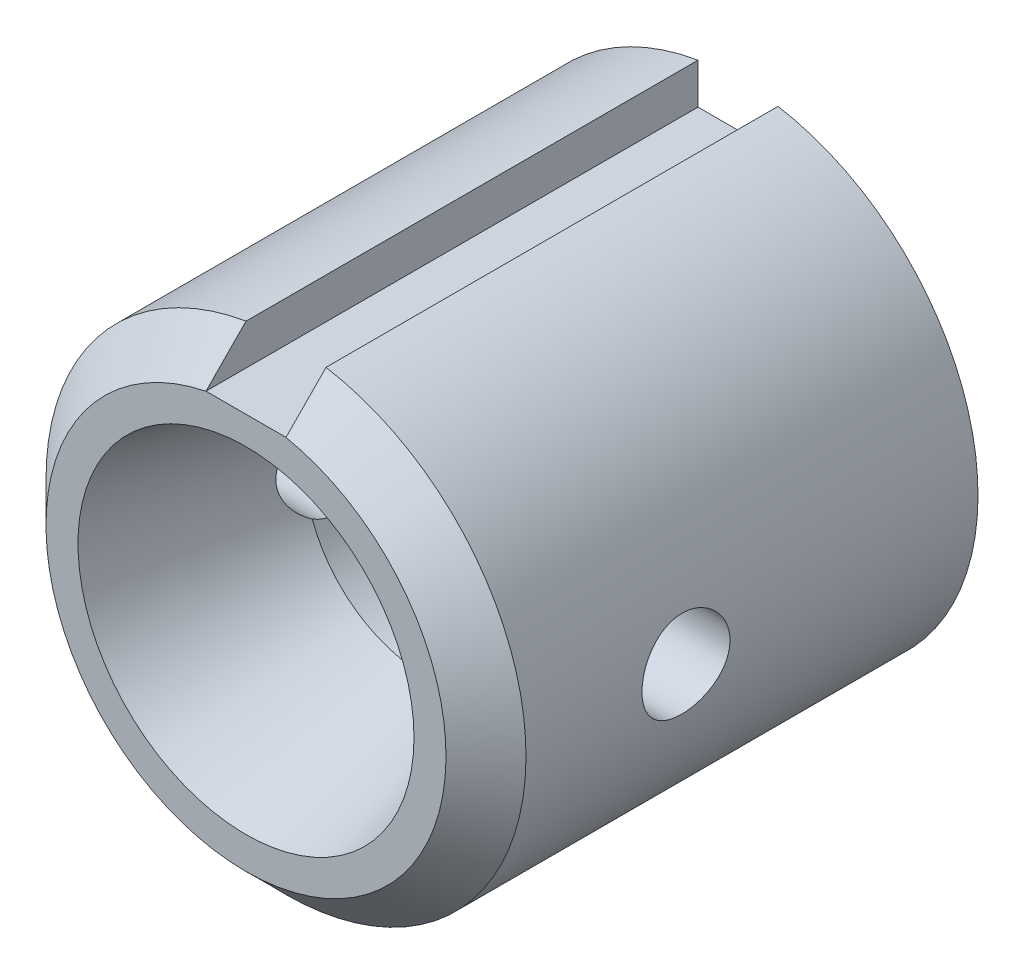
ISO-10303-21;
HEADER;
FILE_DESCRIPTION(('STEP AP214'),'2;1');
FILE_NAME('part.step','',(''),(''),'','','');
FILE_SCHEMA(('AUTOMOTIVE_DESIGN { 1 0 10303 214 1 1 1 1 }'));
ENDSEC;
DATA;
#1=APPLICATION_CONTEXT('core data for automotive mechanical design processes');
#2=APPLICATION_PROTOCOL_DEFINITION('international standard','automotive_design',2000,#1);
#3=PRODUCT_CONTEXT('',#1,'mechanical');
#4=PRODUCT('Part','Part','',(#3));
#5=PRODUCT_RELATED_PRODUCT_CATEGORY('part','',(#4));
#6=PRODUCT_DEFINITION_FORMATION('','',#4);
#7=PRODUCT_DEFINITION_CONTEXT('part definition',#1,'design');
#8=PRODUCT_DEFINITION('design','',#6,#7);
#9=PRODUCT_DEFINITION_SHAPE('','',#8);
#10=(LENGTH_UNIT() NAMED_UNIT(*) SI_UNIT(.MILLI.,.METRE.));
#11=(NAMED_UNIT(*) PLANE_ANGLE_UNIT() SI_UNIT($,.RADIAN.));
#12=(NAMED_UNIT(*) SI_UNIT($,.STERADIAN.) SOLID_ANGLE_UNIT());
#13=UNCERTAINTY_MEASURE_WITH_UNIT(LENGTH_MEASURE(1.E-05),#10,'distance_accuracy_value','');
#14=(GEOMETRIC_REPRESENTATION_CONTEXT(3) GLOBAL_UNCERTAINTY_ASSIGNED_CONTEXT((#13)) GLOBAL_UNIT_ASSIGNED_CONTEXT((#10,
#11,#12)) REPRESENTATION_CONTEXT('',''));
#15=CARTESIAN_POINT('',(0.,0.,0.));
#16=DIRECTION('',(0.,0.,1.));
#17=DIRECTION('',(1.,0.,0.));
#18=AXIS2_PLACEMENT_3D('',#15,#16,#17);
#19=CARTESIAN_POINT('',(60.,295.,6.69999999999993));
#20=DIRECTION('',(0.,0.,1.));
#21=DIRECTION('',(1.,0.,0.));
#22=AXIS2_PLACEMENT_3D('',#19,#20,#21);
#23=CYLINDRICAL_SURFACE('',#22,6.00000000000001);
#24=CARTESIAN_POINT('',(54.0002083369503,294.950000000006,15.1));
#25=CARTESIAN_POINT('',(54.0007202688159,294.888703805956,15.0999976136444));
#26=CARTESIAN_POINT('',(54.0021793161189,294.827384060505,15.0948591515165));
#27=CARTESIAN_POINT('',(54.0068772760834,294.706486979623,15.0744609248708));
#28=CARTESIAN_POINT('',(54.0101177494254,294.646911220344,15.0591922830261));
#29=CARTESIAN_POINT('',(54.0180565924925,294.531267379849,15.019021823251));
#30=CARTESIAN_POINT('',(54.0227536090026,294.475196100623,14.9941289415349));
#31=CARTESIAN_POINT('',(54.0331310874611,294.368037019153,14.9354419332142));
#32=CARTESIAN_POINT('',(54.0388114618121,294.316948773655,14.9016485993204));
#33=CARTESIAN_POINT('',(54.0506392147245,294.22058236755,14.8256843276609));
#34=CARTESIAN_POINT('',(54.0567909881065,294.175373190827,14.7834265482272));
#35=CARTESIAN_POINT('',(54.0688564566633,294.092647768584,14.69191897438));
#36=CARTESIAN_POINT('',(54.0747701354065,294.055132053289,14.6426686984475));
#37=CARTESIAN_POINT('',(54.0857594210672,293.988611386325,14.5381410912283));
#38=CARTESIAN_POINT('',(54.0908288833986,293.959667733592,14.4828240515706));
#39=CARTESIAN_POINT('',(54.099508422817,293.911514034592,14.3679970708575));
#40=CARTESIAN_POINT('',(54.103118635283,293.892303085352,14.3084875193559));
#41=CARTESIAN_POINT('',(54.1084294253396,293.864395585328,14.1877584139369));
#42=CARTESIAN_POINT('',(54.1101534368211,293.855569902812,14.126569757924));
#43=CARTESIAN_POINT('',(54.1115740440727,293.848281914292,14.0035577135561));
#44=CARTESIAN_POINT('',(54.1112708272382,293.849818650395,13.9417343843973));
#45=CARTESIAN_POINT('',(54.1086904705804,293.863111557008,13.8200925702686));
#46=CARTESIAN_POINT('',(54.1064401355067,293.874728959497,13.7602582701753));
#47=CARTESIAN_POINT('',(54.1002528172232,293.907635160738,13.6434043414942));
#48=CARTESIAN_POINT('',(54.0963157622893,293.928924370765,13.5863848327143));
#49=CARTESIAN_POINT('',(54.0871553394533,293.980706097532,13.4763695892091));
#50=CARTESIAN_POINT('',(54.0819241169554,294.011255078881,13.4234011114864));
#51=CARTESIAN_POINT('',(54.0707486996327,294.080646755264,13.3232908566409));
#52=CARTESIAN_POINT('',(54.064804430311,294.119490317219,13.2761496893824));
#53=CARTESIAN_POINT('',(54.0527254784273,294.205127669994,13.1882160745881));
#54=CARTESIAN_POINT('',(54.0465892723377,294.252042021813,13.1475411645983));
#55=CARTESIAN_POINT('',(54.0348733020739,294.352083472418,13.0746204666893));
#56=CARTESIAN_POINT('',(54.029293547541,294.405210678816,13.042374824803));
#57=CARTESIAN_POINT('',(54.0192645696668,294.516347426359,12.9871806884785));
#58=CARTESIAN_POINT('',(54.0148179160766,294.574367674995,12.9642532579587));
#59=CARTESIAN_POINT('',(54.007534630069,294.693538429022,12.9285074801542));
#60=CARTESIAN_POINT('',(54.0046978329856,294.754688613566,12.9156880989033));
#61=CARTESIAN_POINT('',(54.00094206014,294.877443987595,12.9006800981437));
#62=CARTESIAN_POINT('',(53.9999961145571,294.939030015532,12.8983413812102));
#63=CARTESIAN_POINT('',(54.0000039093303,295.061727177229,12.9039671053713));
#64=CARTESIAN_POINT('',(54.0009575463509,295.122838336641,12.9119309860064));
#65=CARTESIAN_POINT('',(54.004599015298,295.242301127035,12.9378026226283));
#66=CARTESIAN_POINT('',(54.0072716759197,295.300672151674,12.9556231971476));
#67=CARTESIAN_POINT('',(54.0140051240663,295.413604054352,13.00061696853));
#68=CARTESIAN_POINT('',(54.0180659928936,295.468164709006,13.0277907131749));
#69=CARTESIAN_POINT('',(54.0271426562016,295.572490881773,13.0910114909173));
#70=CARTESIAN_POINT('',(54.0321670206702,295.622206819054,13.1271390798256));
#71=CARTESIAN_POINT('',(54.0425625124062,295.714926043728,13.2071331108198));
#72=CARTESIAN_POINT('',(54.0479336697108,295.757928748552,13.2510002238311));
#73=CARTESIAN_POINT('',(54.0584705908645,295.836555725121,13.3458878945095));
#74=CARTESIAN_POINT('',(54.0636329081523,295.872080055531,13.3969917255396));
#75=CARTESIAN_POINT('',(54.0730659867747,295.934044772319,13.5045146965415));
#76=CARTESIAN_POINT('',(54.0773367738815,295.960485421301,13.5609336827953));
#77=CARTESIAN_POINT('',(54.0844591195687,296.003419748053,13.6772950233251));
#78=CARTESIAN_POINT('',(54.0873157073753,296.019948719061,13.7372240320187));
#79=CARTESIAN_POINT('',(54.0912836755598,296.042692175733,13.8590627524683));
#80=CARTESIAN_POINT('',(54.0923952270607,296.04890767277,13.9209722694025));
#81=CARTESIAN_POINT('',(54.0927343098606,296.050815155352,14.0440962823263));
#82=CARTESIAN_POINT('',(54.0919877530676,296.04665187492,14.1053085113926));
#83=CARTESIAN_POINT('',(54.0887550720343,296.028236035753,14.226146728523));
#84=CARTESIAN_POINT('',(54.0862689547665,296.013983517458,14.2857727229441));
#85=CARTESIAN_POINT('',(54.0798581465696,295.975853719352,14.4016720612241));
#86=CARTESIAN_POINT('',(54.075935724631,295.951991614305,14.4579505311862));
#87=CARTESIAN_POINT('',(54.0671090671621,295.895334343623,14.5657298943908));
#88=CARTESIAN_POINT('',(54.0622047717955,295.862538633522,14.6172304961853));
#89=CARTESIAN_POINT('',(54.0519089175461,295.78843282202,14.7147228074009));
#90=CARTESIAN_POINT('',(54.0465117922295,295.747016278357,14.760633035478));
#91=CARTESIAN_POINT('',(54.0359147836396,295.65706480142,14.8449011764115));
#92=CARTESIAN_POINT('',(54.0307149443272,295.60852829321,14.8832574139152));
#93=CARTESIAN_POINT('',(54.0210885690767,295.505294322675,14.9515817793949));
#94=CARTESIAN_POINT('',(54.0166678688373,295.45055502821,14.9814875419383));
#95=CARTESIAN_POINT('',(54.0091882263298,295.336768140736,15.0316338167811));
#96=CARTESIAN_POINT('',(54.0061279806199,295.277724734886,15.0518835817815));
#97=CARTESIAN_POINT('',(54.0023561822457,295.173739418562,15.0779473024479));
#98=CARTESIAN_POINT('',(54.0012293133081,295.129408645737,15.0862039547324));
#99=CARTESIAN_POINT('',(53.9999673427956,295.040056142825,15.0972311204959));
#100=CARTESIAN_POINT('',(53.9998322196565,294.995034427783,15.1000017532599));
#101=CARTESIAN_POINT('',(54.0002083369503,294.950000000006,15.1));
#102=B_SPLINE_CURVE_WITH_KNOTS('',3,(#24,#25,#26,#27,#28,#29,#30,#31,#32,#33,#34,#35,#36,#37,
#38,#39,#40,#41,#42,#43,#44,#45,#46,#47,#48,#49,#50,#51,#52,#53,#54,#55,#56,#57,#58,#59,#60,#61,
#62,#63,#64,#65,#66,#67,#68,#69,#70,#71,#72,#73,#74,#75,#76,#77,#78,#79,#80,#81,#82,#83,#84,#85,
#86,#87,#88,#89,#90,#91,#92,#93,#94,#95,#96,#97,#98,#99,#100,#101),.UNSPECIFIED.,.T.,.F.,(4,2,2,
2,2,2,2,2,2,2,2,2,2,2,2,2,2,2,2,2,2,2,2,2,2,2,2,2,2,2,2,2,2,2,2,2,2,2,4),(0.,0.183730043608427,
0.367621307436563,0.551342234646676,0.735046804446842,0.920742716117979,1.10645142143876,
1.29345773065726,1.48044668675653,1.6650851699003,1.84970658544641,2.03182615525273,
2.21395347007397,2.39721450694273,2.58049470700939,2.76679785909897,2.95310423858224,
3.13982945408964,3.3265355667398,3.51055906657045,3.69457255597529,3.87698390584466,
4.05940594071336,4.24353288366222,4.42767579609321,4.61414208533446,4.8006029834939,
4.986395932106,5.17217066019518,5.35536925570794,5.53856711691164,5.72147681261332,
5.90439765840521,6.08972747871189,6.27509835599518,6.46180354399513,6.6483294634961,
6.78331920343493,6.91830600820149),.UNSPECIFIED.);
#103=CARTESIAN_POINT('',(54.0002083369503,294.950000000006,15.1));
#104=VERTEX_POINT('',#103);
#105=EDGE_CURVE('E117',#104,#104,#102,.T.);
#106=ORIENTED_EDGE('',*,*,#105,.T.);
#107=EDGE_LOOP('',(#106));
#108=FACE_BOUND('',#107,.T.);
#109=DIRECTION('',(0.,0.,-1.));
#110=VECTOR('',#109,1.);
#111=CARTESIAN_POINT('',(61.,300.9160797831,19.));
#112=LINE('',#111,#110);
#113=CARTESIAN_POINT('',(61.,300.9160797831,17.9999999999301));
#114=VERTEX_POINT('',#113);
#115=CARTESIAN_POINT('',(61.,300.9160797831,6.69999999999993));
#116=VERTEX_POINT('',#115);
#117=EDGE_CURVE('E226',#114,#116,#112,.T.);
#118=ORIENTED_EDGE('',*,*,#117,.F.);
#119=CARTESIAN_POINT('',(60.,295.,17.9999999999301));
#120=DIRECTION('',(0.,0.,1.));
#121=DIRECTION('',(1.,0.,0.));
#122=AXIS2_PLACEMENT_3D('',#119,#120,#121);
#123=CIRCLE('',#122,6.00000000000001);
#124=CARTESIAN_POINT('',(59.,300.9160797831,17.9999999999302));
#125=VERTEX_POINT('',#124);
#126=EDGE_CURVE('E65',#114,#125,#123,.F.);
#127=ORIENTED_EDGE('',*,*,#126,.T.);
#128=DIRECTION('',(0.,0.,-1.));
#129=VECTOR('',#128,1.);
#130=CARTESIAN_POINT('',(59.,300.9160797831,19.));
#131=LINE('',#130,#129);
#132=CARTESIAN_POINT('',(59.,300.9160797831,6.69999999999993));
#133=VERTEX_POINT('',#132);
#134=EDGE_CURVE('E200',#125,#133,#131,.T.);
#135=ORIENTED_EDGE('',*,*,#134,.T.);
#136=CARTESIAN_POINT('',(60.,295.,6.69999999999993));
#137=DIRECTION('',(0.,0.,1.));
#138=DIRECTION('',(1.,0.,0.));
#139=AXIS2_PLACEMENT_3D('',#136,#137,#138);
#140=CIRCLE('',#139,6.00000000000001);
#141=EDGE_CURVE('E207',#133,#116,#140,.T.);
#142=ORIENTED_EDGE('',*,*,#141,.T.);
#143=EDGE_LOOP('',(#118,#127,#135,#142));
#144=FACE_BOUND('',#143,.T.);
#145=CARTESIAN_POINT('',(65.9997916630497,294.950000000006,15.1));
#146=CARTESIAN_POINT('',(66.0003004436368,295.011181969926,15.0999976551111));
#147=CARTESIAN_POINT('',(65.9998661558239,295.072402500563,15.0948783977039));
#148=CARTESIAN_POINT('',(65.9971955340101,295.193136244978,15.0745412098838));
#149=CARTESIAN_POINT('',(65.9949576814895,295.252647976279,15.0593147715882));
#150=CARTESIAN_POINT('',(65.9889710628795,295.368199710514,15.0192372764761));
#151=CARTESIAN_POINT('',(65.9852235690302,295.424242591033,14.994394324599));
#152=CARTESIAN_POINT('',(65.9766665214643,295.531364787736,14.9358111208835));
#153=CARTESIAN_POINT('',(65.9718570598759,295.582444533932,14.9020716407914));
#154=CARTESIAN_POINT('',(65.9616835542033,295.678748829249,14.8262665705742));
#155=CARTESIAN_POINT('',(65.9563145895184,295.723911870751,14.7841234969513));
#156=CARTESIAN_POINT('',(65.9456861010331,295.806571570897,14.6928747246476));
#157=CARTESIAN_POINT('',(65.9404265849908,295.844067687722,14.6437685342997));
#158=CARTESIAN_POINT('',(65.9305917514955,295.910618550196,14.5395062412071));
#159=CARTESIAN_POINT('',(65.9260222685577,295.939603079002,14.4843047154378));
#160=CARTESIAN_POINT('',(65.9181687217842,295.98786671045,14.3697247061979));
#161=CARTESIAN_POINT('',(65.914884564879,296.007146515833,14.3103465255233));
#162=CARTESIAN_POINT('',(65.9100270369482,296.035270089006,14.1897049258247));
#163=CARTESIAN_POINT('',(65.9084374534213,296.044212825661,14.1284652458107));
#164=CARTESIAN_POINT('',(65.907106891473,296.051714617042,14.0053356007116));
#165=CARTESIAN_POINT('',(65.9073657667413,296.050274493598,13.9434456874812));
#166=CARTESIAN_POINT('',(65.9096862071804,296.037136029832,13.8215315457416));
#167=CARTESIAN_POINT('',(65.9117267995588,296.02555703085,13.7614939968514));
#168=CARTESIAN_POINT('',(65.9173395511307,295.992657347573,13.6442267361927));
#169=CARTESIAN_POINT('',(65.9209117702657,295.971336282011,13.5869971344134));
#170=CARTESIAN_POINT('',(65.9291923347654,295.919439400518,13.4766203108571));
#171=CARTESIAN_POINT('',(65.9339065999542,295.888815144017,13.4234963277177));
#172=CARTESIAN_POINT('',(65.9439147000451,295.819213300378,13.3230950619609));
#173=CARTESIAN_POINT('',(65.9492085870549,295.780234961912,13.2758183058205));
#174=CARTESIAN_POINT('',(65.9598411653169,295.694395236378,13.1877766616267));
#175=CARTESIAN_POINT('',(65.965179479911,295.64743338079,13.147109615161));
#176=CARTESIAN_POINT('',(65.9751983441763,295.54729563423,13.0742176275001));
#177=CARTESIAN_POINT('',(65.9798788928828,295.494119734144,13.0419926986885));
#178=CARTESIAN_POINT('',(65.9880210942491,295.383017596652,12.9869155640423));
#179=CARTESIAN_POINT('',(65.9914825884158,295.325090742766,12.9640645768813));
#180=CARTESIAN_POINT('',(65.9967527679148,295.206146532462,12.9284393964189));
#181=CARTESIAN_POINT('',(65.9985616191026,295.145129486819,12.9156641919533));
#182=CARTESIAN_POINT('',(66.0002655109563,295.022644881657,12.9006926090506));
#183=CARTESIAN_POINT('',(66.0001867222168,294.961195279177,12.8983521024647));
#184=CARTESIAN_POINT('',(65.9981463580624,294.838796484248,12.9039221747406));
#185=CARTESIAN_POINT('',(65.9961848567309,294.777847272205,12.9118323502491));
#186=CARTESIAN_POINT('',(65.9905729129521,294.65855865955,12.9375675767782));
#187=CARTESIAN_POINT('',(65.9869329218651,294.60020552451,12.9553314095047));
#188=CARTESIAN_POINT('',(65.9783240806231,294.487311672641,13.0001951386847));
#189=CARTESIAN_POINT('',(65.9733551341777,294.432771232424,13.0272957116788));
#190=CARTESIAN_POINT('',(65.962523067555,294.328353471764,13.0904281238555));
#191=CARTESIAN_POINT('',(65.9566502194621,294.27853776616,13.1265601762197));
#192=CARTESIAN_POINT('',(65.9446610088691,294.185626614924,13.2065936774515));
#193=CARTESIAN_POINT('',(65.9385446242107,294.142531782554,13.2504958345418));
#194=CARTESIAN_POINT('',(65.9266354748057,294.063728668014,13.345493151653));
#195=CARTESIAN_POINT('',(65.9208477867195,294.028120794663,13.3966723300689));
#196=CARTESIAN_POINT('',(65.910318599719,293.96601232548,13.504386617707));
#197=CARTESIAN_POINT('',(65.9055770549112,293.93951133011,13.5609214918243));
#198=CARTESIAN_POINT('',(65.8977001759835,293.896546298136,13.6774079566571));
#199=CARTESIAN_POINT('',(65.8945554041957,293.88002317511,13.7373370881836));
#200=CARTESIAN_POINT('',(65.8901913464306,293.857291686741,13.859186774471));
#201=CARTESIAN_POINT('',(65.8889718351875,293.851082114653,13.9211070953867));
#202=CARTESIAN_POINT('',(65.8886028500419,293.849192998477,14.0440869702238));
#203=CARTESIAN_POINT('',(65.8894195088634,293.853341177336,14.10514384352));
#204=CARTESIAN_POINT('',(65.8929589656013,293.871673659379,14.2256726304282));
#205=CARTESIAN_POINT('',(65.8956817507091,293.885857895124,14.2851445546877));
#206=CARTESIAN_POINT('',(65.9027228691388,293.923788608455,14.4007288084808));
#207=CARTESIAN_POINT('',(65.9070382572138,293.947517442176,14.4568471187508));
#208=CARTESIAN_POINT('',(65.9167969648917,294.003843828185,14.5643321512167));
#209=CARTESIAN_POINT('',(65.9222403654545,294.036442017099,14.6156985319729));
#210=CARTESIAN_POINT('',(65.9337698935936,294.110177032285,14.7130814068712));
#211=CARTESIAN_POINT('',(65.9398646866455,294.151438550203,14.7590024760511));
#212=CARTESIAN_POINT('',(65.9519794612457,294.241065645667,14.8433259548957));
#213=CARTESIAN_POINT('',(65.9579994246144,294.28943291431,14.881726569678));
#214=CARTESIAN_POINT('',(65.9693903963353,294.392472903797,14.950279695171));
#215=CARTESIAN_POINT('',(65.9747543339126,294.447203698249,14.980346128226));
#216=CARTESIAN_POINT('',(65.9841912967498,294.561020405568,15.0308067157341));
#217=CARTESIAN_POINT('',(65.9882655400507,294.620102143811,15.0512100055543));
#218=CARTESIAN_POINT('',(65.9938325869623,294.724467598911,15.077588068482));
#219=CARTESIAN_POINT('',(65.9957260738773,294.769135254653,15.0859775213402));
#220=CARTESIAN_POINT('',(65.9985167744405,294.85919487081,15.0971842865129));
#221=CARTESIAN_POINT('',(65.9994140134236,294.904586812776,15.1000017405271));
#222=CARTESIAN_POINT('',(65.9997916630497,294.950000000006,15.1));
#223=B_SPLINE_CURVE_WITH_KNOTS('',3,(#145,#146,#147,#148,#149,#150,#151,#152,#153,#154,#155,
#156,#157,#158,#159,#160,#161,#162,#163,#164,#165,#166,#167,#168,#169,#170,#171,#172,#173,#174,
#175,#176,#177,#178,#179,#180,#181,#182,#183,#184,#185,#186,#187,#188,#189,#190,#191,#192,#193,
#194,#195,#196,#197,#198,#199,#200,#201,#202,#203,#204,#205,#206,#207,#208,#209,#210,#211,#212,
#213,#214,#215,#216,#217,#218,#219,#220,#221,#222),.UNSPECIFIED.,.T.,.F.,(4,2,2,2,2,2,2,2,2,2,2,
2,2,2,2,2,2,2,2,2,2,2,2,2,2,2,2,2,2,2,2,2,2,2,2,2,2,2,4),(0.,0.183386467259153,
0.366927499126928,0.550314175536274,0.733684948949655,0.918831903935527,1.10399193870133,
1.29063911260044,1.47727276901466,1.66210436312249,1.84692132750083,2.0295916811869,
2.21226918449923,2.3959146621236,2.57957666293736,2.76574908316017,2.95192177647397,
3.13811866578745,3.32429686676477,3.5078953711051,3.69148665125943,3.87394989708342,
4.05642636698709,4.24102521619444,4.42564089972934,4.61259355742401,4.79953801204667,
4.98536428698171,5.17116881763297,5.35390357582882,5.53663710611146,5.71903438166212,
5.9014447528106,6.08668671292491,6.27197283040299,6.45910680552273,6.64606351254706,
6.78218818756319,6.91830940079264),.UNSPECIFIED.);
#224=CARTESIAN_POINT('',(65.9997916630497,294.950000000006,15.1));
#225=VERTEX_POINT('',#224);
#226=EDGE_CURVE('E119',#225,#225,#223,.T.);
#227=ORIENTED_EDGE('',*,*,#226,.T.);
#228=EDGE_LOOP('',(#227));
#229=FACE_BOUND('',#228,.T.);
#230=ADVANCED_FACE('F36',(#108,#144,#229),#23,.T.);
#231=CARTESIAN_POINT('',(60.,295.,6.69999999999993));
#232=DIRECTION('',(0.,0.,-1.));
#233=DIRECTION('',(-1.,0.,0.));
#234=AXIS2_PLACEMENT_3D('',#231,#232,#233);
#235=CYLINDRICAL_SURFACE('',#234,3.00000000000002);
#236=CARTESIAN_POINT('',(60.,295.,6.69999999999993));
#237=DIRECTION('',(0.,0.,-1.));
#238=DIRECTION('',(-1.,0.,0.));
#239=AXIS2_PLACEMENT_3D('',#236,#237,#238);
#240=CIRCLE('',#239,3.00000000000002);
#241=CARTESIAN_POINT('',(57.,295.,6.69999999999993));
#242=VERTEX_POINT('',#241);
#243=EDGE_CURVE('E151',#242,#242,#240,.T.);
#244=ORIENTED_EDGE('',*,*,#243,.T.);
#245=EDGE_LOOP('',(#244));
#246=FACE_BOUND('',#245,.T.);
#247=CARTESIAN_POINT('',(62.9995833043943,294.950000000006,15.1));
#248=CARTESIAN_POINT('',(63.0005759745772,295.009464727088,15.10000192451));
#249=CARTESIAN_POINT('',(62.9997818578641,295.068946192172,15.0951631427205));
#250=CARTESIAN_POINT('',(62.9947907837317,295.186198561201,15.0759822242544));
#251=CARTESIAN_POINT('',(62.9905943244969,295.243969714292,15.061641478949));
#252=CARTESIAN_POINT('',(62.9793242679031,295.356090278295,15.0240037473474));
#253=CARTESIAN_POINT('',(62.9722555942246,295.410445361982,15.0007220916951));
#254=CARTESIAN_POINT('',(62.9560222574873,295.514498806819,14.9459390118202));
#255=CARTESIAN_POINT('',(62.9468570537377,295.56419596203,14.9144354668929));
#256=CARTESIAN_POINT('',(62.927050081837,295.659412548661,14.8428535093252));
#257=CARTESIAN_POINT('',(62.9163684872221,295.704730546125,14.8025183215854));
#258=CARTESIAN_POINT('',(62.894942006064,295.788142640948,14.7149647955348));
#259=CARTESIAN_POINT('',(62.8841971030355,295.826234762457,14.6677445807996));
#260=CARTESIAN_POINT('',(62.8634619669805,295.895513535211,14.5656402291538));
#261=CARTESIAN_POINT('',(62.8535146836605,295.926390547225,14.5105363215184));
#262=CARTESIAN_POINT('',(62.83611660327,295.978365557859,14.3955282243271));
#263=CARTESIAN_POINT('',(62.8286650084125,295.999466682328,14.3356255763686));
#264=CARTESIAN_POINT('',(62.8174834547286,296.030559832468,14.2148211811406));
#265=CARTESIAN_POINT('',(62.8136369624101,296.040900997866,14.1540204739281));
#266=CARTESIAN_POINT('',(62.80978080996,296.051268344086,14.0314345836093));
#267=CARTESIAN_POINT('',(62.809769764456,296.051298249359,13.9696497640309));
#268=CARTESIAN_POINT('',(62.8134799919414,296.041322764124,13.8502860311142));
#269=CARTESIAN_POINT('',(62.8170062121947,296.031841822372,13.7926560773861));
#270=CARTESIAN_POINT('',(62.8270526718911,296.003987080429,13.6798641615416));
#271=CARTESIAN_POINT('',(62.8335733141806,295.985612083681,13.6247025325907));
#272=CARTESIAN_POINT('',(62.848964618418,295.940202726327,13.5173491648724));
#273=CARTESIAN_POINT('',(62.8578719685796,295.91303166509,13.4652207487592));
#274=CARTESIAN_POINT('',(62.8769854417581,295.850887403856,13.3661023472699));
#275=CARTESIAN_POINT('',(62.8871919758366,295.815911731833,13.3191139969966));
#276=CARTESIAN_POINT('',(62.9084323545236,295.736745213022,13.228737105986));
#277=CARTESIAN_POINT('',(62.9194798007882,295.692136859443,13.185716626533));
#278=CARTESIAN_POINT('',(62.9405732282608,295.596187050188,13.1076619385868));
#279=CARTESIAN_POINT('',(62.9506191069178,295.544844906279,13.0726285474234));
#280=CARTESIAN_POINT('',(62.9686391022655,295.436166027114,13.0112775911562));
#281=CARTESIAN_POINT('',(62.9765921914972,295.378776005648,12.9850478084523));
#282=CARTESIAN_POINT('',(62.9893032580109,295.260044386056,12.9427204400065));
#283=CARTESIAN_POINT('',(62.9940625702207,295.198704450671,12.9266186211773));
#284=CARTESIAN_POINT('',(62.9995935190087,295.077151422357,12.9057230878677));
#285=CARTESIAN_POINT('',(63.0005544157142,295.01703788488,12.9003993227213));
#286=CARTESIAN_POINT('',(62.9988270088297,294.896808045944,12.8996442479994));
#287=CARTESIAN_POINT('',(62.9961393616162,294.836691746928,12.90421115917));
#288=CARTESIAN_POINT('',(62.9874731447249,294.720155174482,12.9227151060123));
#289=CARTESIAN_POINT('',(62.9816020591475,294.663678163739,12.9363492328209));
#290=CARTESIAN_POINT('',(62.9671610417967,294.553878502868,12.9721749492025));
#291=CARTESIAN_POINT('',(62.9585907106563,294.5005563209,12.9943678051918));
#292=CARTESIAN_POINT('',(62.9391836473872,294.3966015533,13.0474924197942));
#293=CARTESIAN_POINT('',(62.928280884803,294.346117891128,13.0786908436107));
#294=CARTESIAN_POINT('',(62.9053955028154,294.250949534723,13.1486369618921));
#295=CARTESIAN_POINT('',(62.8934124752392,294.206267048129,13.1873875163724));
#296=CARTESIAN_POINT('',(62.8687911415104,294.121304877973,13.2739503526239));
#297=CARTESIAN_POINT('',(62.8561544529369,294.081421802952,13.3221534846199));
#298=CARTESIAN_POINT('',(62.8322813685185,294.010254873842,13.4248633715775));
#299=CARTESIAN_POINT('',(62.8210450510259,293.978971500798,13.4793704789251));
#300=CARTESIAN_POINT('',(62.8013143788561,293.926016700872,13.5933065300771));
#301=CARTESIAN_POINT('',(62.7928180848141,293.904338471473,13.6527319551369));
#302=CARTESIAN_POINT('',(62.7796918021708,293.871446262233,13.7748088674783));
#303=CARTESIAN_POINT('',(62.7750592917513,293.860225456469,13.8374582221647));
#304=CARTESIAN_POINT('',(62.7704831516799,293.849150304259,13.9596036900433));
#305=CARTESIAN_POINT('',(62.770241568819,293.848573638527,14.0190238309842));
#306=CARTESIAN_POINT('',(62.773716538186,293.856970324012,14.1370617217064));
#307=CARTESIAN_POINT('',(62.7774327369046,293.865942822296,14.1956795426774));
#308=CARTESIAN_POINT('',(62.7881822963058,293.892644724784,14.308657347786));
#309=CARTESIAN_POINT('',(62.7951120511691,293.910101386838,14.3630924645299));
#310=CARTESIAN_POINT('',(62.8114759807293,293.9530386176,14.4682927406988));
#311=CARTESIAN_POINT('',(62.8209107940381,293.978521232664,14.519056960101));
#312=CARTESIAN_POINT('',(62.841900228313,294.038406939048,14.61850629086));
#313=CARTESIAN_POINT('',(62.8535428752572,294.073223440873,14.6669236532954));
#314=CARTESIAN_POINT('',(62.8773825942808,294.150124296692,14.7574489076428));
#315=CARTESIAN_POINT('',(62.8895798522069,294.192211100341,14.7995546639621));
#316=CARTESIAN_POINT('',(62.91405170259,294.28533447273,14.8787286241908));
#317=CARTESIAN_POINT('',(62.926290487136,294.336746278297,14.9153684975514));
#318=CARTESIAN_POINT('',(62.9488141437471,294.445409078173,14.9794727498507));
#319=CARTESIAN_POINT('',(62.9590988783284,294.502660482913,15.0069364832734));
#320=CARTESIAN_POINT('',(62.9769360796163,294.623558684906,15.0524974077331));
#321=CARTESIAN_POINT('',(62.9843800279978,294.687359388161,15.0702321779413));
#322=CARTESIAN_POINT('',(62.9951492516882,294.817433984541,15.093979393779));
#323=CARTESIAN_POINT('',(62.9984766400927,294.883706590785,15.0999978544873));
#324=CARTESIAN_POINT('',(62.9995833043943,294.950000000006,15.1));
#325=B_SPLINE_CURVE_WITH_KNOTS('',3,(#247,#248,#249,#250,#251,#252,#253,#254,#255,#256,#257,
#258,#259,#260,#261,#262,#263,#264,#265,#266,#267,#268,#269,#270,#271,#272,#273,#274,#275,#276,
#277,#278,#279,#280,#281,#282,#283,#284,#285,#286,#287,#288,#289,#290,#291,#292,#293,#294,#295,
#296,#297,#298,#299,#300,#301,#302,#303,#304,#305,#306,#307,#308,#309,#310,#311,#312,#313,#314,
#315,#316,#317,#318,#319,#320,#321,#322,#323,#324),.UNSPECIFIED.,.T.,.F.,(4,2,2,2,2,2,2,2,2,2,2,
2,2,2,2,2,2,2,2,2,2,2,2,2,2,2,2,2,2,2,2,2,2,2,2,2,2,2,4),(0.,0.178176647846862,0.35632721107391,
0.534173660334971,0.712066027653529,0.896052359283419,1.08008892803933,1.27097245713703,
1.46179490886078,1.64621170516043,1.83056188961364,2.00527635541393,2.18001433282794,
2.35760997181168,2.53526194233696,2.72324133484761,2.91123995492312,3.10106101294755,
3.29080268048291,3.47096131475098,3.65108754260795,3.8254797776371,3.99989782700999,
4.1801304643685,4.36043148948357,4.55101869621373,4.74161656173553,4.9320792261566,
5.12241748172414,5.29978787600796,5.47714242888367,5.64913896102937,5.82117938224389,
6.00267834908956,6.1842385899037,6.37622860260446,6.56823211842767,6.76697189073273,
6.96560960436753),.UNSPECIFIED.);
#326=CARTESIAN_POINT('',(62.855932983809,295.918502472502,14.5215390309175));
#327=VERTEX_POINT('',#326);
#328=CARTESIAN_POINT('',(62.8218172714643,293.981497527511,14.5215390309175));
#329=VERTEX_POINT('',#328);
#330=EDGE_CURVE('E112',#327,#329,#325,.T.);
#331=ORIENTED_EDGE('',*,*,#330,.F.);
#332=CARTESIAN_POINT('',(60.,295.,14.5215390309175));
#333=DIRECTION('',(0.,0.,1.));
#334=DIRECTION('',(1.,0.,0.));
#335=AXIS2_PLACEMENT_3D('',#332,#333,#334);
#336=CIRCLE('',#335,3.00000000000002);
#337=CARTESIAN_POINT('',(57.144067016191,295.918502472502,14.5215390309175));
#338=VERTEX_POINT('',#337);
#339=EDGE_CURVE('E102',#327,#338,#336,.T.);
#340=ORIENTED_EDGE('',*,*,#339,.T.);
#341=CARTESIAN_POINT('',(57.,295.,15.0988630487921));
#342=CARTESIAN_POINT('',(56.9999987420948,294.940547902874,15.1015699726004));
#343=CARTESIAN_POINT('',(57.0017828558072,294.88088745349,15.0994328671522));
#344=CARTESIAN_POINT('',(57.0088001740416,294.762904239308,15.0855974080702));
#345=CARTESIAN_POINT('',(57.0140328966262,294.704581288775,15.0739003903633));
#346=CARTESIAN_POINT('',(57.0274604265415,294.591005353776,15.04144461627));
#347=CARTESIAN_POINT('',(57.0356499202964,294.535747066051,15.02070210162));
#348=CARTESIAN_POINT('',(57.0542420561217,294.429543722626,14.970859770734));
#349=CARTESIAN_POINT('',(57.0646452702227,294.378599786529,14.941757793711));
#350=CARTESIAN_POINT('',(57.0871309180759,294.280399984519,14.8748112139271));
#351=CARTESIAN_POINT('',(57.0992606669636,294.233345665612,14.8366871153964));
#352=CARTESIAN_POINT('',(57.1237261342725,294.146124018738,14.7532775258442));
#353=CARTESIAN_POINT('',(57.1360619206249,294.105959013429,14.7079896294787));
#354=CARTESIAN_POINT('',(57.1602183436764,294.031895943309,14.6091480390334));
#355=CARTESIAN_POINT('',(57.17199312463,293.998347133733,14.5553201949449));
#356=CARTESIAN_POINT('',(57.1930187127528,293.940850011784,14.4423030645773));
#357=CARTESIAN_POINT('',(57.202270313439,293.916898679977,14.3831154717086));
#358=CARTESIAN_POINT('',(57.2167736223353,293.880164729376,14.2631527679512));
#359=CARTESIAN_POINT('',(57.2221523618074,293.867025165885,14.2025029532539));
#360=CARTESIAN_POINT('',(57.2286818388474,293.851142472409,14.0796451459779));
#361=CARTESIAN_POINT('',(57.2298347782197,293.848393928281,14.0174379818553));
#362=CARTESIAN_POINT('',(57.2278272591623,293.853239140328,13.8977108012135));
#363=CARTESIAN_POINT('',(57.2249515092233,293.860150174849,13.8401567742616));
#364=CARTESIAN_POINT('',(57.2157453421398,293.882827779417,13.7271124845561));
#365=CARTESIAN_POINT('',(57.2094145576694,293.898595291055,13.6716224419075));
#366=CARTESIAN_POINT('',(57.1939739952569,293.938550048917,13.5637660093283));
#367=CARTESIAN_POINT('',(57.1848460345147,293.962792535649,13.5114228204599));
#368=CARTESIAN_POINT('',(57.164787397097,294.018951375142,13.4114079366859));
#369=CARTESIAN_POINT('',(57.1538561326339,294.050870231577,13.3637377730587));
#370=CARTESIAN_POINT('',(57.1304498584893,294.124068617733,13.2709125860238));
#371=CARTESIAN_POINT('',(57.1179203617426,294.165844055131,13.2261617278988));
#372=CARTESIAN_POINT('',(57.0932652416689,294.256300475913,13.144131791342));
#373=CARTESIAN_POINT('',(57.0811397239242,294.304983247359,13.1068546536369));
#374=CARTESIAN_POINT('',(57.0581333595492,294.409760960682,13.039723582119));
#375=CARTESIAN_POINT('',(57.0473033018691,294.466040103773,13.0101382784337));
#376=CARTESIAN_POINT('',(57.0284945438562,294.583260763325,12.9609923349033));
#377=CARTESIAN_POINT('',(57.0205147834677,294.644200536189,12.9414279669888));
#378=CARTESIAN_POINT('',(57.0085330580373,294.766106123714,12.9137623276605));
#379=CARTESIAN_POINT('',(57.0043685292317,294.826947832913,12.905185662226));
#380=CARTESIAN_POINT('',(56.9998034120716,294.949342772754,12.8982952762962));
#381=CARTESIAN_POINT('',(56.9994016645545,295.010895778423,12.8999783949075));
#382=CARTESIAN_POINT('',(57.0022479568456,295.129819647888,12.9132283937495));
#383=CARTESIAN_POINT('',(57.0053211164491,295.187249139971,12.9243152617966));
#384=CARTESIAN_POINT('',(57.0144477074544,295.299407906739,12.9553466732494));
#385=CARTESIAN_POINT('',(57.0205013533122,295.354136986808,12.9752918540301));
#386=CARTESIAN_POINT('',(57.0350301429273,295.460292205988,13.0237533696259));
#387=CARTESIAN_POINT('',(57.0435397360889,295.51165761148,13.0523919653051));
#388=CARTESIAN_POINT('',(57.0620471638883,295.609009247512,13.1173150469903));
#389=CARTESIAN_POINT('',(57.072045461217,295.654993797713,13.1536019115485));
#390=CARTESIAN_POINT('',(57.093069594372,295.742905894112,13.2350922712777));
#391=CARTESIAN_POINT('',(57.1041217524728,295.784478639698,13.2806723535805));
#392=CARTESIAN_POINT('',(57.1254976277445,295.85951269372,13.3782481449643));
#393=CARTESIAN_POINT('',(57.1358212125527,295.89297253093,13.4302450151154));
#394=CARTESIAN_POINT('',(57.1546613835363,295.951319044504,13.5403224808594));
#395=CARTESIAN_POINT('',(57.1631446356789,295.976051965656,13.5984907336772));
#396=CARTESIAN_POINT('',(57.1769341158657,296.015251997562,13.7185394735559));
#397=CARTESIAN_POINT('',(57.1822419046146,296.029724152016,13.7804181205188));
#398=CARTESIAN_POINT('',(57.188746349902,296.047347577995,13.9027713528185));
#399=CARTESIAN_POINT('',(57.190137504258,296.05103480981,13.9631584645311));
#400=CARTESIAN_POINT('',(57.189177974978,296.048466444747,14.0836841626962));
#401=CARTESIAN_POINT('',(57.1868279241991,296.0422125295,14.1438227894568));
#402=CARTESIAN_POINT('',(57.1788566053765,296.020428906075,14.2598931090346));
#403=CARTESIAN_POINT('',(57.1733563987534,296.00524194373,14.3158983024811));
#404=CARTESIAN_POINT('',(57.1598440602505,295.966402792018,14.4245664769943));
#405=CARTESIAN_POINT('',(57.1518313962564,295.942748809266,14.4772287472185));
#406=CARTESIAN_POINT('',(57.1338450225716,295.886597251591,14.5799508530846));
#407=CARTESIAN_POINT('',(57.1238076384311,295.853793993204,14.6298321837891));
#408=CARTESIAN_POINT('',(57.1030990094821,295.780645711112,14.7235779215883));
#409=CARTESIAN_POINT('',(57.0924275802973,295.740298486274,14.7674405660946));
#410=CARTESIAN_POINT('',(57.0710492578924,295.650745080446,14.8502114710915));
#411=CARTESIAN_POINT('',(57.0603684102279,295.601191595876,14.8887520957349));
#412=CARTESIAN_POINT('',(57.0408021662758,295.495991812649,14.9569867499181));
#413=CARTESIAN_POINT('',(57.031916941164,295.440344933892,14.9866799361637));
#414=CARTESIAN_POINT('',(57.016738217765,295.322215943392,15.0371763661858));
#415=CARTESIAN_POINT('',(57.0105572269162,295.259553504721,15.0575948498304));
#416=CARTESIAN_POINT('',(57.0021897730876,295.131344850921,15.0869374555882));
#417=CARTESIAN_POINT('',(57.0000013922167,295.065800035875,15.0958670958769));
#418=CARTESIAN_POINT('',(57.,295.,15.0988630487921));
#419=B_SPLINE_CURVE_WITH_KNOTS('',3,(#341,#342,#343,#344,#345,#346,#347,#348,#349,#350,#351,
#352,#353,#354,#355,#356,#357,#358,#359,#360,#361,#362,#363,#364,#365,#366,#367,#368,#369,#370,
#371,#372,#373,#374,#375,#376,#377,#378,#379,#380,#381,#382,#383,#384,#385,#386,#387,#388,#389,
#390,#391,#392,#393,#394,#395,#396,#397,#398,#399,#400,#401,#402,#403,#404,#405,#406,#407,#408,
#409,#410,#411,#412,#413,#414,#415,#416,#417,#418),.UNSPECIFIED.,.T.,.F.,(4,2,2,2,2,2,2,2,2,2,2,
2,2,2,2,2,2,2,2,2,2,2,2,2,2,2,2,2,2,2,2,2,2,2,2,2,2,2,4),(0.,0.178299922776008,
0.356574933718045,0.53453115069548,0.712533407957609,0.897010195529474,1.08154905571947,
1.27412747300138,1.46664525610329,1.6525185016427,1.83829488629861,2.01158465651718,
2.18489285382558,2.35935242241883,2.53386896895109,2.72049730554964,2.90717404197685,
3.09968924072773,3.29213276630466,3.4759327432709,3.65967609694412,3.83456842418734,
4.00947333735599,4.18696194709149,4.3645058360657,4.55166916602074,4.73886641157998,
4.92921402185096,5.11946800138653,5.30009170245522,5.48068485271774,5.6547634258512,
5.8288788920803,6.00970440701506,6.19058276468198,6.38070270780366,6.57084076642491,
6.76827335050386,6.96561107082346),.UNSPECIFIED.);
#420=CARTESIAN_POINT('',(57.1781827285357,293.981497527511,14.5215390309175));
#421=VERTEX_POINT('',#420);
#422=EDGE_CURVE('E110',#421,#338,#419,.T.);
#423=ORIENTED_EDGE('',*,*,#422,.F.);
#424=EDGE_CURVE('E57',#421,#329,#336,.T.);
#425=ORIENTED_EDGE('',*,*,#424,.T.);
#426=EDGE_LOOP('',(#331,#340,#423,#425));
#427=FACE_BOUND('',#426,.T.);
#428=ADVANCED_FACE('F109',(#246,#427),#235,.F.);
#429=CARTESIAN_POINT('',(66.,295.,6.69999999999993));
#430=DIRECTION('',(0.,0.,-1.));
#431=DIRECTION('',(-1.,0.,0.));
#432=AXIS2_PLACEMENT_3D('',#429,#430,#431);
#433=PLANE('',#432);
#434=ORIENTED_EDGE('',*,*,#243,.F.);
#435=EDGE_LOOP('',(#434));
#436=FACE_BOUND('',#435,.T.);
#437=DIRECTION('',(0.,1.,0.));
#438=VECTOR('',#437,1.);
#439=CARTESIAN_POINT('',(59.,299.9,6.69999999999993));
#440=LINE('',#439,#438);
#441=CARTESIAN_POINT('',(59.,299.9,6.69999999999993));
#442=VERTEX_POINT('',#441);
#443=EDGE_CURVE('E204',#442,#133,#440,.T.);
#444=ORIENTED_EDGE('',*,*,#443,.F.);
#445=DIRECTION('',(-1.,0.,0.));
#446=VECTOR('',#445,1.);
#447=CARTESIAN_POINT('',(61.,299.9,6.69999999999993));
#448=LINE('',#447,#446);
#449=CARTESIAN_POINT('',(61.,299.9,6.69999999999993));
#450=VERTEX_POINT('',#449);
#451=EDGE_CURVE('E233',#450,#442,#448,.T.);
#452=ORIENTED_EDGE('',*,*,#451,.F.);
#453=DIRECTION('',(0.,-1.,0.));
#454=VECTOR('',#453,1.);
#455=CARTESIAN_POINT('',(61.,300.9160797831,6.69999999999993));
#456=LINE('',#455,#454);
#457=EDGE_CURVE('E236',#116,#450,#456,.T.);
#458=ORIENTED_EDGE('',*,*,#457,.F.);
#459=ORIENTED_EDGE('',*,*,#141,.F.);
#460=EDGE_LOOP('',(#444,#452,#458,#459));
#461=FACE_BOUND('',#460,.T.);
#462=ADVANCED_FACE('F157',(#436,#461),#433,.T.);
#463=CARTESIAN_POINT('',(60.,295.,19.));
#464=DIRECTION('',(0.,0.,1.));
#465=DIRECTION('',(1.,0.,0.));
#466=AXIS2_PLACEMENT_3D('',#463,#464,#465);
#467=PLANE('',#466);
#468=CARTESIAN_POINT('',(60.,295.,19.));
#469=DIRECTION('',(0.,0.,1.));
#470=DIRECTION('',(1.,0.,0.));
#471=AXIS2_PLACEMENT_3D('',#468,#469,#470);
#472=CIRCLE('',#471,4.19999999999999);
#473=CARTESIAN_POINT('',(64.2,295.,19.));
#474=VERTEX_POINT('',#473);
#475=EDGE_CURVE('E256',#474,#474,#472,.T.);
#476=ORIENTED_EDGE('',*,*,#475,.F.);
#477=EDGE_LOOP('',(#476));
#478=FACE_BOUND('',#477,.T.);
#479=DIRECTION('',(-1.,0.,0.));
#480=VECTOR('',#479,1.);
#481=CARTESIAN_POINT('',(61.,299.9,19.));
#482=LINE('',#481,#480);
#483=CARTESIAN_POINT('',(60.9949874370413,299.9,19.));
#484=VERTEX_POINT('',#483);
#485=CARTESIAN_POINT('',(59.0050125629587,299.9,19.));
#486=VERTEX_POINT('',#485);
#487=EDGE_CURVE('E229',#484,#486,#482,.T.);
#488=ORIENTED_EDGE('',*,*,#487,.T.);
#489=CARTESIAN_POINT('',(60.,295.,19.));
#490=DIRECTION('',(0.,0.,1.));
#491=DIRECTION('',(1.,0.,0.));
#492=AXIS2_PLACEMENT_3D('',#489,#490,#491);
#493=CIRCLE('',#492,4.99999999998702);
#494=EDGE_CURVE('E216',#486,#484,#493,.T.);
#495=ORIENTED_EDGE('',*,*,#494,.T.);
#496=EDGE_LOOP('',(#488,#495));
#497=FACE_BOUND('',#496,.T.);
#498=ADVANCED_FACE('F161',(#478,#497),#467,.T.);
#499=CARTESIAN_POINT('',(59.,299.9,19.));
#500=DIRECTION('',(-1.,0.,0.));
#501=DIRECTION('',(0.,-1.,0.));
#502=AXIS2_PLACEMENT_3D('',#499,#500,#501);
#503=PLANE('',#502);
#504=ORIENTED_EDGE('',*,*,#134,.F.);
#505=CARTESIAN_POINT('',(59.,300.9160797831,17.9999999999301));
#506=CARTESIAN_POINT('',(59.,300.746968736194,18.1667393318243));
#507=CARTESIAN_POINT('',(59.,300.577764997184,18.3333848112719));
#508=CARTESIAN_POINT('',(59.,300.323763904507,18.5831541623751));
#509=CARTESIAN_POINT('',(59.,300.239064296985,18.666377464081));
#510=CARTESIAN_POINT('',(59.,300.06959045671,18.8327481517551));
#511=CARTESIAN_POINT('',(59.,299.984816223911,18.9158955376765));
#512=CARTESIAN_POINT('',(59.,299.9,18.9990000999669));
#513=B_SPLINE_CURVE_WITH_KNOTS('',3,(#505,#506,#507,#508,#509,#510,#511,#512),.UNSPECIFIED.,.F.,
.F.,(4,2,2,4),(0.,0.712464094480361,1.06869610757547,1.42492833983932),.UNSPECIFIED.);
#514=CARTESIAN_POINT('',(59.,299.9,18.9990000999669));
#515=VERTEX_POINT('',#514);
#516=EDGE_CURVE('E51',#125,#515,#513,.T.);
#517=ORIENTED_EDGE('',*,*,#516,.T.);
#518=DIRECTION('',(0.,0.,-1.));
#519=VECTOR('',#518,1.);
#520=CARTESIAN_POINT('',(59.,299.9,19.));
#521=LINE('',#520,#519);
#522=EDGE_CURVE('E208',#515,#442,#521,.T.);
#523=ORIENTED_EDGE('',*,*,#522,.T.);
#524=ORIENTED_EDGE('',*,*,#443,.T.);
#525=EDGE_LOOP('',(#504,#517,#523,#524));
#526=FACE_BOUND('',#525,.T.);
#527=ADVANCED_FACE('F165',(#526),#503,.F.);
#528=CARTESIAN_POINT('',(61.,299.9,19.));
#529=DIRECTION('',(0.,-1.,0.));
#530=DIRECTION('',(0.,0.,-1.));
#531=AXIS2_PLACEMENT_3D('',#528,#529,#530);
#532=PLANE('',#531);
#533=ORIENTED_EDGE('',*,*,#487,.F.);
#534=CARTESIAN_POINT('',(60.9949874370413,299.9,19.));
#535=CARTESIAN_POINT('',(60.9958229413342,299.9,18.9998337366677));
#536=CARTESIAN_POINT('',(60.9966584070606,299.9,18.9996672799988));
#537=CARTESIAN_POINT('',(60.9983292613801,299.9,18.9993339799877));
#538=CARTESIAN_POINT('',(60.9991646499733,299.9,18.9991671366457));
#539=CARTESIAN_POINT('',(61.,299.9,18.999000099967));
#540=B_SPLINE_CURVE_WITH_KNOTS('',3,(#534,#535,#536,#537,#538,#539),.UNSPECIFIED.,.F.,.F.,(4,2,
4),(0.,0.00255565984093292,0.00511131968183983),.UNSPECIFIED.);
#541=CARTESIAN_POINT('',(61.,299.9,18.9990000999669));
#542=VERTEX_POINT('',#541);
#543=EDGE_CURVE('E182',#484,#542,#540,.T.);
#544=ORIENTED_EDGE('',*,*,#543,.T.);
#545=DIRECTION('',(0.,0.,-1.));
#546=VECTOR('',#545,1.);
#547=CARTESIAN_POINT('',(61.,299.9,19.));
#548=LINE('',#547,#546);
#549=EDGE_CURVE('E228',#542,#450,#548,.T.);
#550=ORIENTED_EDGE('',*,*,#549,.T.);
#551=ORIENTED_EDGE('',*,*,#451,.T.);
#552=ORIENTED_EDGE('',*,*,#522,.F.);
#553=CARTESIAN_POINT('',(59.,299.9,18.9990000999669));
#554=CARTESIAN_POINT('',(59.0008353500267,299.9,18.9991671366456));
#555=CARTESIAN_POINT('',(59.0016707386199,299.9,18.9993339799877));
#556=CARTESIAN_POINT('',(59.0033415929395,299.9,18.9996672799988));
#557=CARTESIAN_POINT('',(59.0041770586658,299.9,18.9998337366677));
#558=CARTESIAN_POINT('',(59.0050125629587,299.9,19.));
#559=B_SPLINE_CURVE_WITH_KNOTS('',3,(#553,#554,#555,#556,#557,#558),.UNSPECIFIED.,.F.,.F.,(4,2,
4),(0.,0.00255565984090351,0.00511131968183233),.UNSPECIFIED.);
#560=EDGE_CURVE('E214',#515,#486,#559,.T.);
#561=ORIENTED_EDGE('',*,*,#560,.T.);
#562=EDGE_LOOP('',(#533,#544,#550,#551,#552,#561));
#563=FACE_BOUND('',#562,.T.);
#564=ADVANCED_FACE('F171',(#563),#532,.F.);
#565=CARTESIAN_POINT('',(61.,300.9160797831,19.));
#566=DIRECTION('',(1.,0.,0.));
#567=DIRECTION('',(0.,0.,-1.));
#568=AXIS2_PLACEMENT_3D('',#565,#566,#567);
#569=PLANE('',#568);
#570=ORIENTED_EDGE('',*,*,#549,.F.);
#571=CARTESIAN_POINT('',(61.,299.9,18.9990000999669));
#572=CARTESIAN_POINT('',(61.,299.984816223911,18.9158955376765));
#573=CARTESIAN_POINT('',(61.,300.06959045671,18.8327481517551));
#574=CARTESIAN_POINT('',(61.,300.239064296985,18.666377464081));
#575=CARTESIAN_POINT('',(61.,300.323763904507,18.583154162375));
#576=CARTESIAN_POINT('',(61.,300.577764997184,18.3333848112718));
#577=CARTESIAN_POINT('',(61.,300.746968736194,18.1667393318242));
#578=CARTESIAN_POINT('',(61.,300.9160797831,17.9999999999301));
#579=B_SPLINE_CURVE_WITH_KNOTS('',3,(#571,#572,#573,#574,#575,#576,#577,#578),.UNSPECIFIED.,.F.,
.F.,(4,2,2,4),(0.,0.356232232263859,0.712464245358983,1.42492833983937),.UNSPECIFIED.);
#580=EDGE_CURVE('E175',#542,#114,#579,.T.);
#581=ORIENTED_EDGE('',*,*,#580,.T.);
#582=ORIENTED_EDGE('',*,*,#117,.T.);
#583=ORIENTED_EDGE('',*,*,#457,.T.);
#584=EDGE_LOOP('',(#570,#581,#582,#583));
#585=FACE_BOUND('',#584,.T.);
#586=ADVANCED_FACE('F167',(#585),#569,.F.);
#587=CARTESIAN_POINT('',(60.,295.,19.));
#588=DIRECTION('',(0.,0.,-1.));
#589=DIRECTION('',(-1.,0.,0.));
#590=AXIS2_PLACEMENT_3D('',#587,#588,#589);
#591=CONICAL_SURFACE('',#590,4.99999999998701,0.785398163369018);
#592=ORIENTED_EDGE('',*,*,#516,.F.);
#593=ORIENTED_EDGE('',*,*,#126,.F.);
#594=ORIENTED_EDGE('',*,*,#580,.F.);
#595=ORIENTED_EDGE('',*,*,#543,.F.);
#596=ORIENTED_EDGE('',*,*,#494,.F.);
#597=ORIENTED_EDGE('',*,*,#560,.F.);
#598=EDGE_LOOP('',(#592,#593,#594,#595,#596,#597));
#599=FACE_BOUND('',#598,.T.);
#600=ADVANCED_FACE('F38',(#599),#591,.T.);
#601=CARTESIAN_POINT('',(80.,294.950000000006,14.));
#602=DIRECTION('',(-1.,0.,0.));
#603=DIRECTION('',(0.,0.,1.));
#604=AXIS2_PLACEMENT_3D('',#601,#602,#603);
#605=CYLINDRICAL_SURFACE('',#604,1.1);
#606=CARTESIAN_POINT('',(62.5557957540026,295.882057273507,13.4158174609643));
#607=CARTESIAN_POINT('',(62.5574662150367,295.897671829775,13.4407285411352));
#608=CARTESIAN_POINT('',(62.5595434732646,295.912266213479,13.466236682364));
#609=CARTESIAN_POINT('',(62.5645844339652,295.93933888184,13.518264646082));
#610=CARTESIAN_POINT('',(62.5675480489864,295.951817375069,13.5447843685395));
#611=CARTESIAN_POINT('',(62.5778705714191,295.985944233929,13.6255345231773));
#612=CARTESIAN_POINT('',(62.5866645735657,296.004319286461,13.6810125574695));
#613=CARTESIAN_POINT('',(62.6089665160523,296.033001153288,13.7975655906922));
#614=CARTESIAN_POINT('',(62.6227747990873,296.042611347735,13.858751221592));
#615=CARTESIAN_POINT('',(62.6543911069413,296.051522523568,13.9806978581509));
#616=CARTESIAN_POINT('',(62.6721886874631,296.050850122045,14.0414595529472));
#617=CARTESIAN_POINT('',(62.6934552769062,296.044777138776,14.1072417457812));
#618=CARTESIAN_POINT('',(62.6954396472862,296.044164574269,14.1133204069825));
#619=CARTESIAN_POINT('',(62.7191030300008,296.036323207033,14.1851226770078));
#620=CARTESIAN_POINT('',(62.7426192626906,296.023252032908,14.2497396854166));
#621=CARTESIAN_POINT('',(62.7917987088961,295.986168870868,14.3750351533508));
#622=CARTESIAN_POINT('',(62.8174691303366,295.962118851106,14.4356990772178));
#623=CARTESIAN_POINT('',(62.8692253946364,295.903936390245,14.5515328389877));
#624=CARTESIAN_POINT('',(62.8953097191191,295.869835148333,14.6067189817379));
#625=CARTESIAN_POINT('',(62.9463286168513,295.792196350376,14.7105680021838));
#626=CARTESIAN_POINT('',(62.9712638112531,295.748663966563,14.7592344318419));
#627=CARTESIAN_POINT('',(63.0187512149371,295.651935681836,14.8495545776004));
#628=CARTESIAN_POINT('',(63.041250890031,295.598576112214,14.8910621293383));
#629=CARTESIAN_POINT('',(63.0814268895076,295.483827537386,14.9641795345959));
#630=CARTESIAN_POINT('',(63.099107532359,295.42244579455,14.9957982535463));
#631=CARTESIAN_POINT('',(63.1261948693791,295.300810334931,15.0443760486207));
#632=CARTESIAN_POINT('',(63.1363130472838,295.241219794263,15.0625919497247));
#633=CARTESIAN_POINT('',(63.1503139249125,295.119131676835,15.088704531533));
#634=CARTESIAN_POINT('',(63.1542037866796,295.056637524241,15.0966130629009));
#635=CARTESIAN_POINT('',(63.1552373411965,294.939518648929,15.1012998412542));
#636=CARTESIAN_POINT('',(63.1532071352316,294.884949189102,15.0994148370797));
#637=CARTESIAN_POINT('',(63.1442687047728,294.777090313312,15.0876779368704));
#638=CARTESIAN_POINT('',(63.1373608005256,294.723800813551,15.0778265638636));
#639=CARTESIAN_POINT('',(63.1193436321638,294.621004347862,15.0509664537683));
#640=CARTESIAN_POINT('',(63.1083212754151,294.571443003953,15.0341050018365));
#641=CARTESIAN_POINT('',(63.0827544165063,294.475977852809,14.9939750768236));
#642=CARTESIAN_POINT('',(63.0682091912206,294.43007479907,14.9707052881932));
#643=CARTESIAN_POINT('',(63.0348169819284,294.338367917465,14.9159857293263));
#644=CARTESIAN_POINT('',(63.0156884643191,294.293012502673,14.8839586672828));
#645=CARTESIAN_POINT('',(62.9751593524469,294.208167135131,14.814070072619));
#646=CARTESIAN_POINT('',(62.9537566462939,294.168682717471,14.776203101868));
#647=CARTESIAN_POINT('',(62.9065295897377,294.090808010129,14.6896722439981));
#648=CARTESIAN_POINT('',(62.8805117484788,294.053389857113,14.6402387782719));
#649=CARTESIAN_POINT('',(62.8283116778834,293.987400836002,14.535916297046));
#650=CARTESIAN_POINT('',(62.8021296310994,293.95882147782,14.4810325841532));
#651=CARTESIAN_POINT('',(62.7628815369033,293.922164358067,14.3932675268796));
#652=CARTESIAN_POINT('',(62.7493532315016,293.910719723813,14.3619588337117));
#653=CARTESIAN_POINT('',(62.7228940838171,293.890671721679,14.2982245780254));
#654=CARTESIAN_POINT('',(62.7099626768819,293.882065619188,14.2658001238804));
#655=CARTESIAN_POINT('',(62.6887171831258,293.8699752248,14.2099899026369));
#656=CARTESIAN_POINT('',(62.6801927625836,293.865729187134,14.1868471946834));
#657=CARTESIAN_POINT('',(62.6636137687887,293.858712826023,14.140181008987));
#658=CARTESIAN_POINT('',(62.6555592140457,293.855942560678,14.1166575162904));
#659=CARTESIAN_POINT('',(62.6263096423915,293.8484017253,14.0276435598131));
#660=CARTESIAN_POINT('',(62.6068770915955,293.848661143474,13.9609962634155));
#661=CARTESIAN_POINT('',(62.5817692296155,293.858327175723,13.8607185984494));
#662=CARTESIAN_POINT('',(62.5740461847971,293.863141267603,13.8270789481065));
#663=CARTESIAN_POINT('',(62.5600665094459,293.875940008469,13.7600890416993));
#664=CARTESIAN_POINT('',(62.5538103533367,293.88392568097,13.7267388826118));
#665=CARTESIAN_POINT('',(62.5483228158223,293.893509710298,13.6936859981127));
#666=B_SPLINE_CURVE_WITH_KNOTS('',3,(#606,#607,#608,#609,#610,#611,#612,#613,#614,#615,#616,
#617,#618,#619,#620,#621,#622,#623,#624,#625,#626,#627,#628,#629,#630,#631,#632,#633,#634,#635,
#636,#637,#638,#639,#640,#641,#642,#643,#644,#645,#646,#647,#648,#649,#650,#651,#652,#653,#654,
#655,#656,#657,#658,#659,#660,#661,#662,#663,#664,#665),.UNSPECIFIED.,.F.,.F.,(4,2,2,2,2,2,2,2,
2,2,2,2,2,2,2,2,2,2,2,2,2,2,2,2,2,2,2,2,2,4),(0.,0.0882905996536944,0.176572491075921,
0.352938482054667,0.54233836167875,0.731248052029984,0.750520528379073,0.959254997248057,
1.16871809592136,1.37753774391503,1.58624315952875,1.79880425089012,2.01117422934907,
2.19943238699102,2.38747390760832,2.55058264349357,2.71368067142427,2.87351247703266,
3.03337711854787,3.20887041738214,3.38452813369852,3.58542178515529,3.78612186493607,
3.89393695134587,4.00164786440652,4.07667245022369,4.15169998952993,4.35847890020236,
4.46287814465701,4.5673111076723),.UNSPECIFIED.);
#667=EDGE_CURVE('E113',#327,#329,#666,.T.);
#668=ORIENTED_EDGE('',*,*,#667,.F.);
#669=ORIENTED_EDGE('',*,*,#330,.T.);
#670=EDGE_LOOP('',(#668,#669));
#671=FACE_BOUND('',#670,.T.);
#672=ORIENTED_EDGE('',*,*,#226,.F.);
#673=EDGE_LOOP('',(#672));
#674=FACE_BOUND('',#673,.T.);
#675=ADVANCED_FACE('F134',(#671,#674),#605,.F.);
#676=CARTESIAN_POINT('',(57.4516617196043,293.893482744429,13.6937790198791));
#677=CARTESIAN_POINT('',(57.4467957131725,293.884992182428,13.7230703633601));
#678=CARTESIAN_POINT('',(57.4413275799607,293.877755284507,13.7526004926232));
#679=CARTESIAN_POINT('',(57.429231387017,293.865776023545,13.8119195645204));
#680=CARTESIAN_POINT('',(57.4226036606029,293.861032945235,13.8417084304501));
#681=CARTESIAN_POINT('',(57.4011616212502,293.850576970699,13.9306678019526));
#682=CARTESIAN_POINT('',(57.3847064697456,293.848497853961,13.9899220895007));
#683=CARTESIAN_POINT('',(57.3568324801184,293.852427138166,14.0794178486746));
#684=CARTESIAN_POINT('',(57.3466597387254,293.855106539048,14.1102617118594));
#685=CARTESIAN_POINT('',(57.3254699786893,293.862993845276,14.1713658180491));
#686=CARTESIAN_POINT('',(57.314452154779,293.868204188174,14.2016254691281));
#687=CARTESIAN_POINT('',(57.2781793658335,293.888744694841,14.2970323003383));
#688=CARTESIAN_POINT('',(57.2516196180855,293.908732377628,14.3607363193299));
#689=CARTESIAN_POINT('',(57.1970013197651,293.959524769639,14.4830770704281));
#690=CARTESIAN_POINT('',(57.1689396724739,293.990352620331,14.5417026247175));
#691=CARTESIAN_POINT('',(57.1131487415903,294.062019272593,14.6525630037456));
#692=CARTESIAN_POINT('',(57.0854191078268,294.102846329771,14.7048052187979));
#693=CARTESIAN_POINT('',(57.0320505669177,294.193855939178,14.8016596457835));
#694=CARTESIAN_POINT('',(57.0064107541713,294.244034407762,14.8462751719539));
#695=CARTESIAN_POINT('',(56.9593836870445,294.352215058234,14.9257957642416));
#696=CARTESIAN_POINT('',(56.9379448354522,294.410105400703,14.9608210697889));
#697=CARTESIAN_POINT('',(56.9007824431563,294.53283122654,15.020095320718));
#698=CARTESIAN_POINT('',(56.8850511378684,294.597657117996,15.044358916482));
#699=CARTESIAN_POINT('',(56.8626233890888,294.722566436702,15.0778929431601));
#700=CARTESIAN_POINT('',(56.8549698997493,294.782041775716,15.0887877339989));
#701=CARTESIAN_POINT('',(56.845767142699,294.90242635591,15.1006290899914));
#702=CARTESIAN_POINT('',(56.8442127214382,294.963334342736,15.1015840551613));
#703=CARTESIAN_POINT('',(56.8471173323631,295.07715638671,15.09393670133));
#704=CARTESIAN_POINT('',(56.8508904773394,295.13016796021,15.0864454463912));
#705=CARTESIAN_POINT('',(56.8629287130259,295.234052524741,15.0640194664553));
#706=CARTESIAN_POINT('',(56.8711939589881,295.284925441791,15.0490844841963));
#707=CARTESIAN_POINT('',(56.8917303683804,295.383875877502,15.0122124269739));
#708=CARTESIAN_POINT('',(56.9040468147637,295.431914200691,14.9901962656733));
#709=CARTESIAN_POINT('',(56.9318685197756,295.523650193348,14.9400326874666));
#710=CARTESIAN_POINT('',(56.9473746377512,295.567346688345,14.9118836181392));
#711=CARTESIAN_POINT('',(56.9826399657952,295.654481773276,14.8467533002922));
#712=CARTESIAN_POINT('',(57.0026822959254,295.697326119741,14.8091317294976));
#713=CARTESIAN_POINT('',(57.0445672117834,295.776344138553,14.7282562913767));
#714=CARTESIAN_POINT('',(57.0664117028373,295.812510616532,14.6849964342511));
#715=CARTESIAN_POINT('',(57.1137606430186,295.882050579539,14.5876410434614));
#716=CARTESIAN_POINT('',(57.1393652540932,295.914411663689,14.5328696528489));
#717=CARTESIAN_POINT('',(57.1899132168359,295.969291328442,14.4184044752629));
#718=CARTESIAN_POINT('',(57.2148576007413,295.991826244661,14.3587190556153));
#719=CARTESIAN_POINT('',(57.2500291307254,296.017274949175,14.2680344120747));
#720=CARTESIAN_POINT('',(57.2610962281861,296.02427464999,14.2384591904556));
#721=CARTESIAN_POINT('',(57.282601758388,296.035830739412,14.1786075995656));
#722=CARTESIAN_POINT('',(57.2930401628407,296.040387018147,14.1483311988293));
#723=CARTESIAN_POINT('',(57.3218690494158,296.049822514044,14.0606935883299));
#724=CARTESIAN_POINT('',(57.3392964989312,296.051548566848,14.0026359648889));
#725=CARTESIAN_POINT('',(57.370584100501,296.045627802281,13.8859369546456));
#726=CARTESIAN_POINT('',(57.3844407281733,296.037971767397,13.8272950499885));
#727=CARTESIAN_POINT('',(57.40252685586,296.018920402885,13.7384482952502));
#728=CARTESIAN_POINT('',(57.4082277848099,296.010949086808,13.7077720221677));
#729=CARTESIAN_POINT('',(57.4184641013133,295.992316595909,13.6470353959226));
#730=CARTESIAN_POINT('',(57.4229993593174,295.98165512237,13.6169751115606));
#731=CARTESIAN_POINT('',(57.4309371179512,295.957653687232,13.5576646106106));
#732=CARTESIAN_POINT('',(57.434335531736,295.944304332595,13.5284176559797));
#733=CARTESIAN_POINT('',(57.4400580726069,295.91505017524,13.4711174953095));
#734=CARTESIAN_POINT('',(57.4423820952409,295.899145124262,13.4430644055782));
#735=CARTESIAN_POINT('',(57.444208972425,295.882013143716,13.4157470582416));
#736=B_SPLINE_CURVE_WITH_KNOTS('',3,(#676,#677,#678,#679,#680,#681,#682,#683,#684,#685,#686,
#687,#688,#689,#690,#691,#692,#693,#694,#695,#696,#697,#698,#699,#700,#701,#702,#703,#704,#705,
#706,#707,#708,#709,#710,#711,#712,#713,#714,#715,#716,#717,#718,#719,#720,#721,#722,#723,#724,
#725,#726,#727,#728,#729,#730,#731,#732,#733,#734,#735),.UNSPECIFIED.,.F.,.F.,(4,2,2,2,2,2,2,2,
2,2,2,2,2,2,2,2,2,2,2,2,2,2,2,2,2,2,2,2,2,4),(0.,0.0925727691005323,0.185118972327695,
0.368681569785194,0.466354259007954,0.564121203876026,0.778516161394428,0.993371613623169,
1.20797591130212,1.4224867126216,1.63417011487789,1.84556445214776,2.02734080126985,
2.20896352109933,2.36922090164477,2.5294838212135,2.69160270171078,2.85376531688186,
3.03436621782853,3.21516056717346,3.42001780446662,3.62453316403477,3.72147693439011,
3.81842506355839,3.9995326682136,4.18081834633837,4.277309409847,4.37381119247327,
4.4706562522881,4.5675107253892),.UNSPECIFIED.);
#737=EDGE_CURVE('E11',#421,#338,#736,.T.);
#738=ORIENTED_EDGE('',*,*,#737,.F.);
#739=ORIENTED_EDGE('',*,*,#422,.T.);
#740=EDGE_LOOP('',(#738,#739));
#741=FACE_BOUND('',#740,.T.);
#742=ORIENTED_EDGE('',*,*,#105,.F.);
#743=EDGE_LOOP('',(#742));
#744=FACE_BOUND('',#743,.T.);
#745=ADVANCED_FACE('F115',(#741,#744),#605,.F.);
#746=CARTESIAN_POINT('',(60.,295.,19.));
#747=DIRECTION('',(0.,0.,1.));
#748=DIRECTION('',(1.,0.,0.));
#749=AXIS2_PLACEMENT_3D('',#746,#747,#748);
#750=CONICAL_SURFACE('',#749,4.19999999999999,0.26179938779915);
#751=ORIENTED_EDGE('',*,*,#667,.T.);
#752=ORIENTED_EDGE('',*,*,#424,.F.);
#753=ORIENTED_EDGE('',*,*,#737,.T.);
#754=ORIENTED_EDGE('',*,*,#339,.F.);
#755=EDGE_LOOP('',(#751,#752,#753,#754));
#756=FACE_BOUND('',#755,.T.);
#757=ORIENTED_EDGE('',*,*,#475,.T.);
#758=EDGE_LOOP('',(#757));
#759=FACE_BOUND('',#758,.T.);
#760=ADVANCED_FACE('F100',(#756,#759),#750,.F.);
#761=CLOSED_SHELL('',(#230,#428,#462,#498,#527,#564,#586,#600,#675,#745,#760));
#762=MANIFOLD_SOLID_BREP('B2',#761);
#763=ADVANCED_BREP_SHAPE_REPRESENTATION('',(#18,#762),#14);
#764=SHAPE_DEFINITION_REPRESENTATION(#9,#763);
ENDSEC;
END-ISO-10303-21;
